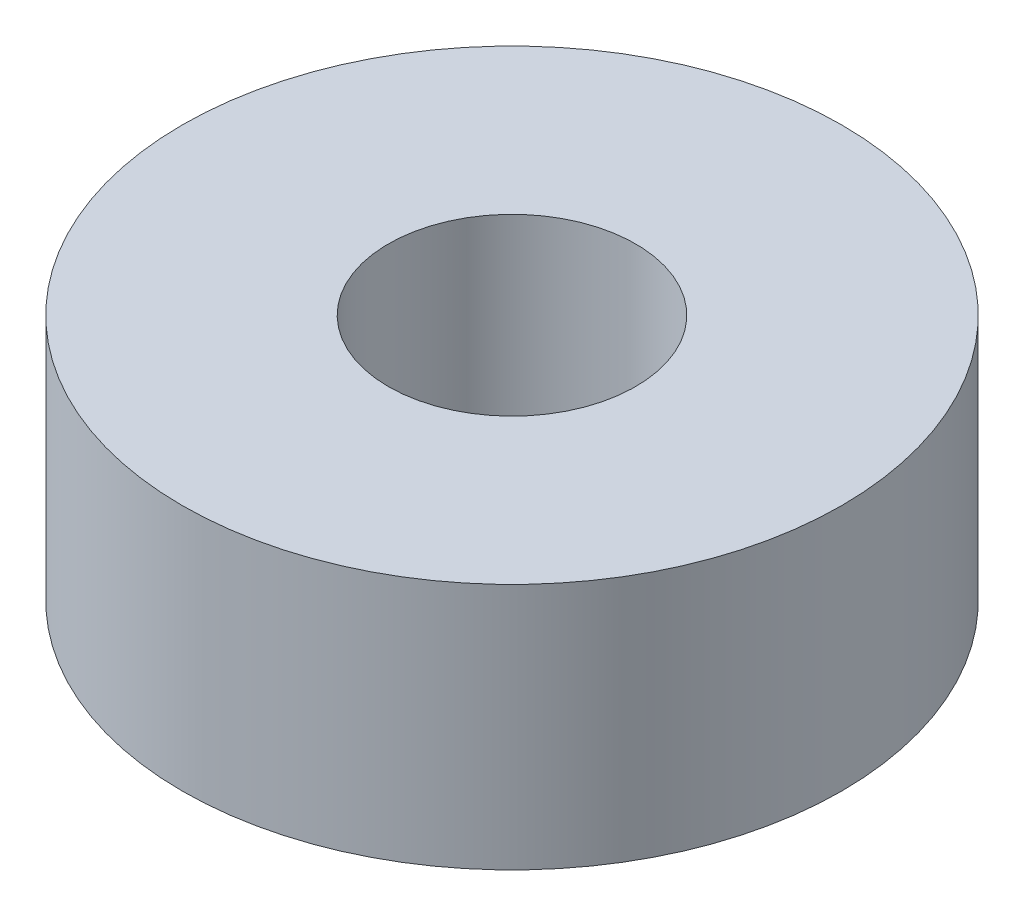
ISO-10303-21;
HEADER;
FILE_DESCRIPTION(('STEP AP214'),'2;1');
FILE_NAME('part.step','',(''),(''),'','','');
FILE_SCHEMA(('AUTOMOTIVE_DESIGN { 1 0 10303 214 1 1 1 1 }'));
ENDSEC;
DATA;
#1=APPLICATION_CONTEXT('core data for automotive mechanical design processes');
#2=APPLICATION_PROTOCOL_DEFINITION('international standard','automotive_design',2000,#1);
#3=PRODUCT_CONTEXT('',#1,'mechanical');
#4=PRODUCT('Part','Part','',(#3));
#5=PRODUCT_RELATED_PRODUCT_CATEGORY('part','',(#4));
#6=PRODUCT_DEFINITION_FORMATION('','',#4);
#7=PRODUCT_DEFINITION_CONTEXT('part definition',#1,'design');
#8=PRODUCT_DEFINITION('design','',#6,#7);
#9=PRODUCT_DEFINITION_SHAPE('','',#8);
#10=(LENGTH_UNIT() NAMED_UNIT(*) SI_UNIT(.MILLI.,.METRE.));
#11=(NAMED_UNIT(*) PLANE_ANGLE_UNIT() SI_UNIT($,.RADIAN.));
#12=(NAMED_UNIT(*) SI_UNIT($,.STERADIAN.) SOLID_ANGLE_UNIT());
#13=UNCERTAINTY_MEASURE_WITH_UNIT(LENGTH_MEASURE(1.E-05),#10,'distance_accuracy_value','');
#14=(GEOMETRIC_REPRESENTATION_CONTEXT(3) GLOBAL_UNCERTAINTY_ASSIGNED_CONTEXT((#13)) GLOBAL_UNIT_ASSIGNED_CONTEXT((#10,
#11,#12)) REPRESENTATION_CONTEXT('',''));
#15=CARTESIAN_POINT('',(0.,0.,0.));
#16=DIRECTION('',(0.,0.,1.));
#17=DIRECTION('',(1.,0.,0.));
#18=AXIS2_PLACEMENT_3D('',#15,#16,#17);
#19=CARTESIAN_POINT('',(0.,6.,0.));
#20=DIRECTION('',(0.,1.,0.));
#21=DIRECTION('',(0.,0.,1.));
#22=AXIS2_PLACEMENT_3D('',#19,#20,#21);
#23=PLANE('',#22);
#24=CARTESIAN_POINT('',(0.,6.,0.));
#25=DIRECTION('',(0.,1.,0.));
#26=DIRECTION('',(0.,0.,1.));
#27=AXIS2_PLACEMENT_3D('',#24,#25,#26);
#28=CIRCLE('',#27,8.);
#29=CARTESIAN_POINT('',(0.,6.,8.));
#30=VERTEX_POINT('',#29);
#31=EDGE_CURVE('E10',#30,#30,#28,.T.);
#32=ORIENTED_EDGE('',*,*,#31,.T.);
#33=EDGE_LOOP('',(#32));
#34=FACE_BOUND('',#33,.T.);
#35=CARTESIAN_POINT('',(0.,6.,0.));
#36=DIRECTION('',(0.,1.,0.));
#37=DIRECTION('',(0.,0.,1.));
#38=AXIS2_PLACEMENT_3D('',#35,#36,#37);
#39=CIRCLE('',#38,3.);
#40=CARTESIAN_POINT('',(0.,6.,3.));
#41=VERTEX_POINT('',#40);
#42=EDGE_CURVE('E44',#41,#41,#39,.T.);
#43=ORIENTED_EDGE('',*,*,#42,.F.);
#44=EDGE_LOOP('',(#43));
#45=FACE_BOUND('',#44,.T.);
#46=ADVANCED_FACE('F33',(#34,#45),#23,.T.);
#47=CARTESIAN_POINT('',(0.,0.,0.));
#48=DIRECTION('',(0.,1.,0.));
#49=DIRECTION('',(0.,0.,1.));
#50=AXIS2_PLACEMENT_3D('',#47,#48,#49);
#51=PLANE('',#50);
#52=CARTESIAN_POINT('',(0.,0.,0.));
#53=DIRECTION('',(0.,1.,0.));
#54=DIRECTION('',(0.,0.,1.));
#55=AXIS2_PLACEMENT_3D('',#52,#53,#54);
#56=CIRCLE('',#55,8.);
#57=CARTESIAN_POINT('',(0.,0.,8.));
#58=VERTEX_POINT('',#57);
#59=EDGE_CURVE('E37',#58,#58,#56,.T.);
#60=ORIENTED_EDGE('',*,*,#59,.F.);
#61=EDGE_LOOP('',(#60));
#62=FACE_BOUND('',#61,.T.);
#63=CARTESIAN_POINT('',(0.,0.,0.));
#64=DIRECTION('',(0.,1.,0.));
#65=DIRECTION('',(0.,0.,1.));
#66=AXIS2_PLACEMENT_3D('',#63,#64,#65);
#67=CIRCLE('',#66,3.);
#68=CARTESIAN_POINT('',(0.,0.,3.));
#69=VERTEX_POINT('',#68);
#70=EDGE_CURVE('E46',#69,#69,#67,.T.);
#71=ORIENTED_EDGE('',*,*,#70,.T.);
#72=EDGE_LOOP('',(#71));
#73=FACE_BOUND('',#72,.T.);
#74=ADVANCED_FACE('F56',(#62,#73),#51,.F.);
#75=CARTESIAN_POINT('',(0.,6.,0.));
#76=DIRECTION('',(0.,-1.,0.));
#77=DIRECTION('',(0.,0.,-1.));
#78=AXIS2_PLACEMENT_3D('',#75,#76,#77);
#79=CYLINDRICAL_SURFACE('',#78,8.);
#80=ORIENTED_EDGE('',*,*,#31,.F.);
#81=EDGE_LOOP('',(#80));
#82=FACE_BOUND('',#81,.T.);
#83=ORIENTED_EDGE('',*,*,#59,.T.);
#84=EDGE_LOOP('',(#83));
#85=FACE_BOUND('',#84,.T.);
#86=ADVANCED_FACE('F35',(#82,#85),#79,.T.);
#87=CARTESIAN_POINT('',(0.,6.,0.));
#88=DIRECTION('',(0.,-1.,0.));
#89=DIRECTION('',(0.,0.,-1.));
#90=AXIS2_PLACEMENT_3D('',#87,#88,#89);
#91=CYLINDRICAL_SURFACE('',#90,3.);
#92=ORIENTED_EDGE('',*,*,#42,.T.);
#93=EDGE_LOOP('',(#92));
#94=FACE_BOUND('',#93,.T.);
#95=ORIENTED_EDGE('',*,*,#70,.F.);
#96=EDGE_LOOP('',(#95));
#97=FACE_BOUND('',#96,.T.);
#98=ADVANCED_FACE('F52',(#94,#97),#91,.F.);
#99=CLOSED_SHELL('',(#46,#74,#86,#98));
#100=MANIFOLD_SOLID_BREP('B2',#99);
#101=ADVANCED_BREP_SHAPE_REPRESENTATION('',(#18,#100),#14);
#102=SHAPE_DEFINITION_REPRESENTATION(#9,#101);
ENDSEC;
END-ISO-10303-21;
